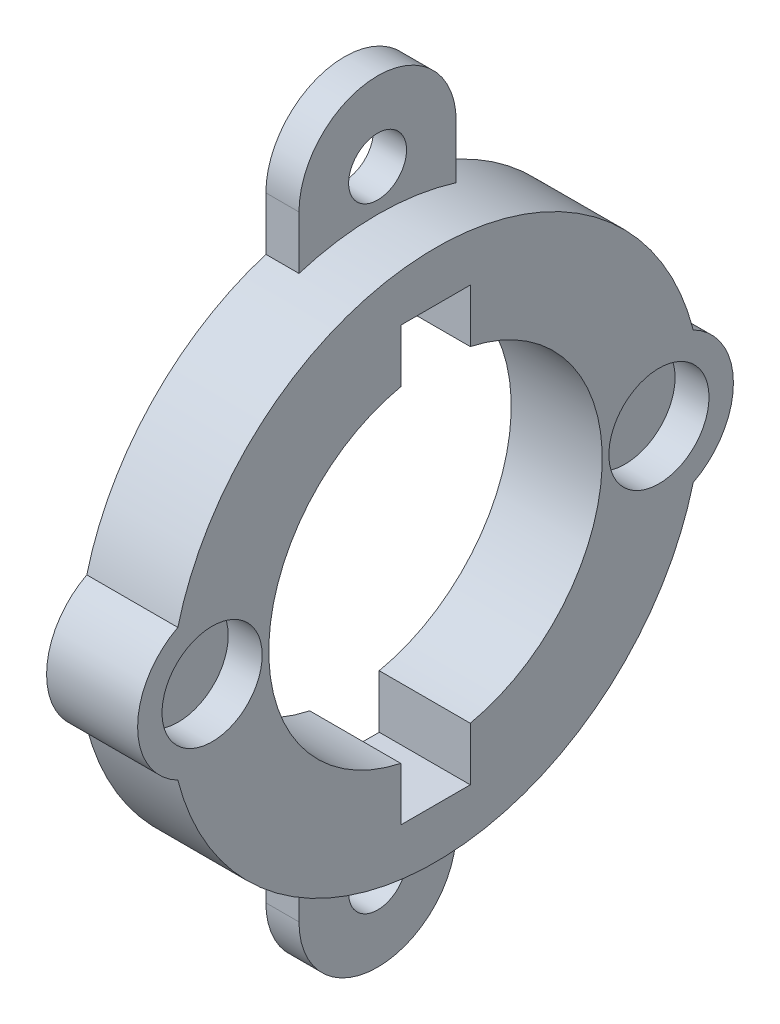
ISO-10303-21;
HEADER;
FILE_DESCRIPTION(('STEP AP214'),'2;1');
FILE_NAME('part.step','',(''),(''),'','','');
FILE_SCHEMA(('AUTOMOTIVE_DESIGN { 1 0 10303 214 1 1 1 1 }'));
ENDSEC;
DATA;
#1=APPLICATION_CONTEXT('core data for automotive mechanical design processes');
#2=APPLICATION_PROTOCOL_DEFINITION('international standard','automotive_design',2000,#1);
#3=PRODUCT_CONTEXT('',#1,'mechanical');
#4=PRODUCT('Part','Part','',(#3));
#5=PRODUCT_RELATED_PRODUCT_CATEGORY('part','',(#4));
#6=PRODUCT_DEFINITION_FORMATION('','',#4);
#7=PRODUCT_DEFINITION_CONTEXT('part definition',#1,'design');
#8=PRODUCT_DEFINITION('design','',#6,#7);
#9=PRODUCT_DEFINITION_SHAPE('','',#8);
#10=(LENGTH_UNIT() NAMED_UNIT(*) SI_UNIT(.MILLI.,.METRE.));
#11=(NAMED_UNIT(*) PLANE_ANGLE_UNIT() SI_UNIT($,.RADIAN.));
#12=(NAMED_UNIT(*) SI_UNIT($,.STERADIAN.) SOLID_ANGLE_UNIT());
#13=UNCERTAINTY_MEASURE_WITH_UNIT(LENGTH_MEASURE(1.E-05),#10,'distance_accuracy_value','');
#14=(GEOMETRIC_REPRESENTATION_CONTEXT(3) GLOBAL_UNCERTAINTY_ASSIGNED_CONTEXT((#13)) GLOBAL_UNIT_ASSIGNED_CONTEXT((#10,
#11,#12)) REPRESENTATION_CONTEXT('',''));
#15=CARTESIAN_POINT('',(0.,0.,0.));
#16=DIRECTION('',(0.,0.,1.));
#17=DIRECTION('',(1.,0.,0.));
#18=AXIS2_PLACEMENT_3D('',#15,#16,#17);
#19=CARTESIAN_POINT('',(5.,15.3571848006072,-4.74999999999994));
#20=DIRECTION('',(0.,0.,1.));
#21=DIRECTION('',(0.,-1.,0.));
#22=AXIS2_PLACEMENT_3D('',#19,#20,#21);
#23=PLANE('',#22);
#24=DIRECTION('',(0.,-1.,0.));
#25=VECTOR('',#24,1.);
#26=CARTESIAN_POINT('',(2.,15.3571848006072,-4.74999999999995));
#27=LINE('',#26,#25);
#28=CARTESIAN_POINT('',(2.,18.575,-4.74999999999992));
#29=VERTEX_POINT('',#28);
#30=CARTESIAN_POINT('',(2.,15.3571848006072,-4.74999999999995));
#31=VERTEX_POINT('',#30);
#32=EDGE_CURVE('E177',#29,#31,#27,.T.);
#33=ORIENTED_EDGE('',*,*,#32,.T.);
#34=DIRECTION('',(-1.,0.,0.));
#35=VECTOR('',#34,1.);
#36=CARTESIAN_POINT('',(5.,15.3571848006072,-4.74999999999994));
#37=LINE('',#36,#35);
#38=CARTESIAN_POINT('',(0.,15.3571848006072,-4.74999999999994));
#39=VERTEX_POINT('',#38);
#40=EDGE_CURVE('E12',#31,#39,#37,.T.);
#41=ORIENTED_EDGE('',*,*,#40,.T.);
#42=DIRECTION('',(0.,1.,0.));
#43=VECTOR('',#42,1.);
#44=CARTESIAN_POINT('',(0.,15.3571848006072,-4.74999999999994));
#45=LINE('',#44,#43);
#46=CARTESIAN_POINT('',(0.,18.575,-4.74999999999993));
#47=VERTEX_POINT('',#46);
#48=EDGE_CURVE('E194',#39,#47,#45,.T.);
#49=ORIENTED_EDGE('',*,*,#48,.T.);
#50=DIRECTION('',(-1.,0.,0.));
#51=VECTOR('',#50,1.);
#52=CARTESIAN_POINT('',(5.,18.575,-4.74999999999993));
#53=LINE('',#52,#51);
#54=EDGE_CURVE('E48',#29,#47,#53,.T.);
#55=ORIENTED_EDGE('',*,*,#54,.F.);
#56=EDGE_LOOP('',(#33,#41,#49,#55));
#57=FACE_BOUND('',#56,.T.);
#58=ADVANCED_FACE('F40',(#57),#23,.F.);
#59=CARTESIAN_POINT('',(5.,18.575,0.));
#60=DIRECTION('',(-1.,0.,0.));
#61=DIRECTION('',(0.,0.,1.));
#62=AXIS2_PLACEMENT_3D('',#59,#60,#61);
#63=CYLINDRICAL_SURFACE('',#62,4.75000000000001);
#64=CARTESIAN_POINT('',(2.,18.575,0.));
#65=DIRECTION('',(1.,0.,0.));
#66=DIRECTION('',(0.,0.,-1.));
#67=AXIS2_PLACEMENT_3D('',#64,#65,#66);
#68=CIRCLE('',#67,4.75);
#69=CARTESIAN_POINT('',(2.,18.575,4.75000000000008));
#70=VERTEX_POINT('',#69);
#71=EDGE_CURVE('E56',#70,#29,#68,.F.);
#72=ORIENTED_EDGE('',*,*,#71,.T.);
#73=ORIENTED_EDGE('',*,*,#54,.T.);
#74=CARTESIAN_POINT('',(0.,18.575,0.));
#75=DIRECTION('',(1.,0.,0.));
#76=DIRECTION('',(0.,0.,-1.));
#77=AXIS2_PLACEMENT_3D('',#74,#75,#76);
#78=CIRCLE('',#77,4.75000000000001);
#79=CARTESIAN_POINT('',(0.,18.575,4.75000000000008));
#80=VERTEX_POINT('',#79);
#81=EDGE_CURVE('E317',#47,#80,#78,.T.);
#82=ORIENTED_EDGE('',*,*,#81,.T.);
#83=DIRECTION('',(-1.,0.,0.));
#84=VECTOR('',#83,1.);
#85=CARTESIAN_POINT('',(5.,18.575,4.75000000000008));
#86=LINE('',#85,#84);
#87=EDGE_CURVE('E190',#70,#80,#86,.T.);
#88=ORIENTED_EDGE('',*,*,#87,.F.);
#89=EDGE_LOOP('',(#72,#73,#82,#88));
#90=FACE_BOUND('',#89,.T.);
#91=ADVANCED_FACE('F187',(#90),#63,.T.);
#92=CARTESIAN_POINT('',(5.,15.3571848006072,4.75000000000007));
#93=DIRECTION('',(0.,0.,-1.));
#94=DIRECTION('',(0.,1.,0.));
#95=AXIS2_PLACEMENT_3D('',#92,#93,#94);
#96=PLANE('',#95);
#97=DIRECTION('',(0.,1.,0.));
#98=VECTOR('',#97,1.);
#99=CARTESIAN_POINT('',(2.,18.575,4.75000000000008));
#100=LINE('',#99,#98);
#101=CARTESIAN_POINT('',(2.,15.3571848006072,4.75000000000007));
#102=VERTEX_POINT('',#101);
#103=EDGE_CURVE('E191',#102,#70,#100,.T.);
#104=ORIENTED_EDGE('',*,*,#103,.T.);
#105=ORIENTED_EDGE('',*,*,#87,.T.);
#106=DIRECTION('',(0.,-1.,0.));
#107=VECTOR('',#106,1.);
#108=CARTESIAN_POINT('',(0.,15.3571848006072,4.75000000000007));
#109=LINE('',#108,#107);
#110=CARTESIAN_POINT('',(0.,15.3571848006072,4.75000000000007));
#111=VERTEX_POINT('',#110);
#112=EDGE_CURVE('E319',#80,#111,#109,.T.);
#113=ORIENTED_EDGE('',*,*,#112,.T.);
#114=DIRECTION('',(-1.,0.,0.));
#115=VECTOR('',#114,1.);
#116=CARTESIAN_POINT('',(5.,15.3571848006072,4.75000000000007));
#117=LINE('',#116,#115);
#118=EDGE_CURVE('E197',#102,#111,#117,.T.);
#119=ORIENTED_EDGE('',*,*,#118,.F.);
#120=EDGE_LOOP('',(#104,#105,#113,#119));
#121=FACE_BOUND('',#120,.T.);
#122=ADVANCED_FACE('F348',(#121),#96,.F.);
#123=CARTESIAN_POINT('',(5.,-15.3571848006072,4.74999999999994));
#124=DIRECTION('',(0.,0.,-1.));
#125=DIRECTION('',(0.,1.,0.));
#126=AXIS2_PLACEMENT_3D('',#123,#124,#125);
#127=PLANE('',#126);
#128=DIRECTION('',(0.,1.,0.));
#129=VECTOR('',#128,1.);
#130=CARTESIAN_POINT('',(2.,-15.3571848006072,4.74999999999995));
#131=LINE('',#130,#129);
#132=CARTESIAN_POINT('',(2.,-18.575,4.74999999999994));
#133=VERTEX_POINT('',#132);
#134=CARTESIAN_POINT('',(2.,-15.3571848006072,4.74999999999995));
#135=VERTEX_POINT('',#134);
#136=EDGE_CURVE('E384',#133,#135,#131,.T.);
#137=ORIENTED_EDGE('',*,*,#136,.T.);
#138=DIRECTION('',(-1.,0.,0.));
#139=VECTOR('',#138,1.);
#140=CARTESIAN_POINT('',(5.,-15.3571848006072,4.74999999999994));
#141=LINE('',#140,#139);
#142=CARTESIAN_POINT('',(0.,-15.3571848006072,4.74999999999994));
#143=VERTEX_POINT('',#142);
#144=EDGE_CURVE('E341',#135,#143,#141,.T.);
#145=ORIENTED_EDGE('',*,*,#144,.T.);
#146=DIRECTION('',(0.,-1.,0.));
#147=VECTOR('',#146,1.);
#148=CARTESIAN_POINT('',(0.,-15.3571848006072,4.74999999999994));
#149=LINE('',#148,#147);
#150=CARTESIAN_POINT('',(0.,-18.575,4.74999999999994));
#151=VERTEX_POINT('',#150);
#152=EDGE_CURVE('E326',#143,#151,#149,.T.);
#153=ORIENTED_EDGE('',*,*,#152,.T.);
#154=DIRECTION('',(-1.,0.,0.));
#155=VECTOR('',#154,1.);
#156=CARTESIAN_POINT('',(5.,-18.575,4.74999999999994));
#157=LINE('',#156,#155);
#158=EDGE_CURVE('E339',#133,#151,#157,.T.);
#159=ORIENTED_EDGE('',*,*,#158,.F.);
#160=EDGE_LOOP('',(#137,#145,#153,#159));
#161=FACE_BOUND('',#160,.T.);
#162=ADVANCED_FACE('F383',(#161),#127,.F.);
#163=CARTESIAN_POINT('',(5.,-18.575,0.));
#164=DIRECTION('',(-1.,0.,0.));
#165=DIRECTION('',(0.,0.,1.));
#166=AXIS2_PLACEMENT_3D('',#163,#164,#165);
#167=CYLINDRICAL_SURFACE('',#166,4.75000000000001);
#168=CARTESIAN_POINT('',(2.,-18.575,0.));
#169=DIRECTION('',(1.,0.,0.));
#170=DIRECTION('',(0.,0.,-1.));
#171=AXIS2_PLACEMENT_3D('',#168,#169,#170);
#172=CIRCLE('',#171,4.75000000000001);
#173=CARTESIAN_POINT('',(2.,-18.575,-4.75000000000008));
#174=VERTEX_POINT('',#173);
#175=EDGE_CURVE('E64',#174,#133,#172,.F.);
#176=ORIENTED_EDGE('',*,*,#175,.T.);
#177=ORIENTED_EDGE('',*,*,#158,.T.);
#178=CARTESIAN_POINT('',(0.,-18.575,0.));
#179=DIRECTION('',(1.,0.,0.));
#180=DIRECTION('',(0.,0.,1.));
#181=AXIS2_PLACEMENT_3D('',#178,#179,#180);
#182=CIRCLE('',#181,4.75000000000001);
#183=CARTESIAN_POINT('',(0.,-18.575,-4.75000000000008));
#184=VERTEX_POINT('',#183);
#185=EDGE_CURVE('E329',#151,#184,#182,.T.);
#186=ORIENTED_EDGE('',*,*,#185,.T.);
#187=DIRECTION('',(-1.,0.,0.));
#188=VECTOR('',#187,1.);
#189=CARTESIAN_POINT('',(5.,-18.575,-4.75000000000008));
#190=LINE('',#189,#188);
#191=EDGE_CURVE('E337',#174,#184,#190,.T.);
#192=ORIENTED_EDGE('',*,*,#191,.F.);
#193=EDGE_LOOP('',(#176,#177,#186,#192));
#194=FACE_BOUND('',#193,.T.);
#195=ADVANCED_FACE('F379',(#194),#167,.T.);
#196=CARTESIAN_POINT('',(5.,-15.3571848006072,-4.75000000000007));
#197=DIRECTION('',(0.,0.,1.));
#198=DIRECTION('',(0.,-1.,0.));
#199=AXIS2_PLACEMENT_3D('',#196,#197,#198);
#200=PLANE('',#199);
#201=DIRECTION('',(0.,-1.,0.));
#202=VECTOR('',#201,1.);
#203=CARTESIAN_POINT('',(2.,-18.575,-4.75000000000008));
#204=LINE('',#203,#202);
#205=CARTESIAN_POINT('',(2.,-15.3571848006072,-4.75000000000006));
#206=VERTEX_POINT('',#205);
#207=EDGE_CURVE('E386',#206,#174,#204,.T.);
#208=ORIENTED_EDGE('',*,*,#207,.T.);
#209=ORIENTED_EDGE('',*,*,#191,.T.);
#210=DIRECTION('',(0.,1.,0.));
#211=VECTOR('',#210,1.);
#212=CARTESIAN_POINT('',(0.,-15.3571848006072,-4.75000000000007));
#213=LINE('',#212,#211);
#214=CARTESIAN_POINT('',(0.,-15.3571848006072,-4.75000000000007));
#215=VERTEX_POINT('',#214);
#216=EDGE_CURVE('E332',#184,#215,#213,.T.);
#217=ORIENTED_EDGE('',*,*,#216,.T.);
#218=DIRECTION('',(-1.,0.,0.));
#219=VECTOR('',#218,1.);
#220=CARTESIAN_POINT('',(5.,-15.3571848006072,-4.75000000000007));
#221=LINE('',#220,#219);
#222=EDGE_CURVE('E335',#206,#215,#221,.T.);
#223=ORIENTED_EDGE('',*,*,#222,.F.);
#224=EDGE_LOOP('',(#208,#209,#217,#223));
#225=FACE_BOUND('',#224,.T.);
#226=ADVANCED_FACE('F375',(#225),#200,.F.);
#227=CARTESIAN_POINT('',(5.,18.575,0.));
#228=DIRECTION('',(-1.,0.,0.));
#229=DIRECTION('',(0.,0.,1.));
#230=AXIS2_PLACEMENT_3D('',#227,#228,#229);
#231=CYLINDRICAL_SURFACE('',#230,1.75);
#232=CARTESIAN_POINT('',(0.,18.575,0.));
#233=DIRECTION('',(1.,0.,0.));
#234=DIRECTION('',(0.,0.,-1.));
#235=AXIS2_PLACEMENT_3D('',#232,#233,#234);
#236=CIRCLE('',#235,1.75);
#237=CARTESIAN_POINT('',(0.,18.575,-1.74999999999992));
#238=VERTEX_POINT('',#237);
#239=EDGE_CURVE('E309',#238,#238,#236,.T.);
#240=ORIENTED_EDGE('',*,*,#239,.F.);
#241=EDGE_LOOP('',(#240));
#242=FACE_BOUND('',#241,.T.);
#243=CARTESIAN_POINT('',(2.,18.575,0.));
#244=DIRECTION('',(1.,0.,0.));
#245=DIRECTION('',(0.,0.,-1.));
#246=AXIS2_PLACEMENT_3D('',#243,#244,#245);
#247=CIRCLE('',#246,1.75);
#248=CARTESIAN_POINT('',(2.,18.575,-1.74999999999992));
#249=VERTEX_POINT('',#248);
#250=EDGE_CURVE('E43',#249,#249,#247,.T.);
#251=ORIENTED_EDGE('',*,*,#250,.T.);
#252=EDGE_LOOP('',(#251));
#253=FACE_BOUND('',#252,.T.);
#254=ADVANCED_FACE('F461',(#242,#253),#231,.F.);
#255=CARTESIAN_POINT('',(5.,-18.575,0.));
#256=DIRECTION('',(-1.,0.,0.));
#257=DIRECTION('',(0.,0.,1.));
#258=AXIS2_PLACEMENT_3D('',#255,#256,#257);
#259=CYLINDRICAL_SURFACE('',#258,1.75);
#260=CARTESIAN_POINT('',(0.,-18.575,0.));
#261=DIRECTION('',(1.,0.,0.));
#262=DIRECTION('',(0.,0.,1.));
#263=AXIS2_PLACEMENT_3D('',#260,#261,#262);
#264=CIRCLE('',#263,1.75);
#265=CARTESIAN_POINT('',(0.,-18.575,1.74999999999993));
#266=VERTEX_POINT('',#265);
#267=EDGE_CURVE('E286',#266,#266,#264,.T.);
#268=ORIENTED_EDGE('',*,*,#267,.F.);
#269=EDGE_LOOP('',(#268));
#270=FACE_BOUND('',#269,.T.);
#271=CARTESIAN_POINT('',(2.,-18.575,0.));
#272=DIRECTION('',(1.,0.,0.));
#273=DIRECTION('',(0.,0.,-1.));
#274=AXIS2_PLACEMENT_3D('',#271,#272,#273);
#275=CIRCLE('',#274,1.75);
#276=CARTESIAN_POINT('',(2.,-18.575,-1.75000000000007));
#277=VERTEX_POINT('',#276);
#278=EDGE_CURVE('E183',#277,#277,#275,.T.);
#279=ORIENTED_EDGE('',*,*,#278,.T.);
#280=EDGE_LOOP('',(#279));
#281=FACE_BOUND('',#280,.T.);
#282=ADVANCED_FACE('F465',(#270,#281),#259,.F.);
#283=CARTESIAN_POINT('',(5.,0.,0.));
#284=DIRECTION('',(-1.,0.,0.));
#285=DIRECTION('',(0.,0.,1.));
#286=AXIS2_PLACEMENT_3D('',#283,#284,#285);
#287=CYLINDRICAL_SURFACE('',#286,16.075);
#288=ORIENTED_EDGE('',*,*,#40,.F.);
#289=CARTESIAN_POINT('',(2.,0.,0.));
#290=DIRECTION('',(1.,0.,0.));
#291=DIRECTION('',(0.,0.,-1.));
#292=AXIS2_PLACEMENT_3D('',#289,#290,#291);
#293=CIRCLE('',#292,16.075);
#294=EDGE_CURVE('E179',#31,#102,#293,.T.);
#295=ORIENTED_EDGE('',*,*,#294,.T.);
#296=ORIENTED_EDGE('',*,*,#118,.T.);
#297=CARTESIAN_POINT('',(0.,0.,0.));
#298=DIRECTION('',(1.,0.,0.));
#299=DIRECTION('',(0.,0.,-1.));
#300=AXIS2_PLACEMENT_3D('',#297,#298,#299);
#301=CIRCLE('',#300,16.075);
#302=CARTESIAN_POINT('',(0.,3.99533525899501,15.5705787037037));
#303=VERTEX_POINT('',#302);
#304=EDGE_CURVE('E323',#111,#303,#301,.T.);
#305=ORIENTED_EDGE('',*,*,#304,.T.);
#306=DIRECTION('',(-1.,0.,0.));
#307=VECTOR('',#306,1.);
#308=CARTESIAN_POINT('',(2.75,3.99533525899501,15.5705787037037));
#309=LINE('',#308,#307);
#310=CARTESIAN_POINT('',(5.5,3.99533525899501,15.5705787037037));
#311=VERTEX_POINT('',#310);
#312=EDGE_CURVE('E226',#303,#311,#309,.F.);
#313=ORIENTED_EDGE('',*,*,#312,.T.);
#314=CARTESIAN_POINT('',(5.5,0.,0.));
#315=DIRECTION('',(1.,0.,0.));
#316=DIRECTION('',(0.,0.,-1.));
#317=AXIS2_PLACEMENT_3D('',#314,#315,#316);
#318=CIRCLE('',#317,16.075);
#319=CARTESIAN_POINT('',(5.5,3.99533525899501,-15.5705787037037));
#320=VERTEX_POINT('',#319);
#321=EDGE_CURVE('E264',#320,#311,#318,.T.);
#322=ORIENTED_EDGE('',*,*,#321,.F.);
#323=DIRECTION('',(-1.,0.,0.));
#324=VECTOR('',#323,1.);
#325=CARTESIAN_POINT('',(2.75,3.99533525899501,-15.5705787037037));
#326=LINE('',#325,#324);
#327=CARTESIAN_POINT('',(0.,3.99533525899501,-15.5705787037037));
#328=VERTEX_POINT('',#327);
#329=EDGE_CURVE('E235',#320,#328,#326,.T.);
#330=ORIENTED_EDGE('',*,*,#329,.T.);
#331=CARTESIAN_POINT('',(0.,0.,0.));
#332=DIRECTION('',(1.,0.,0.));
#333=DIRECTION('',(0.,0.,-1.));
#334=AXIS2_PLACEMENT_3D('',#331,#332,#333);
#335=CIRCLE('',#334,16.075);
#336=EDGE_CURVE('E312',#328,#39,#335,.T.);
#337=ORIENTED_EDGE('',*,*,#336,.T.);
#338=EDGE_LOOP('',(#288,#295,#296,#305,#313,#322,#330,#337));
#339=FACE_BOUND('',#338,.T.);
#340=ADVANCED_FACE('F344',(#339),#287,.T.);
#341=CARTESIAN_POINT('',(5.,0.,0.));
#342=DIRECTION('',(-1.,0.,0.));
#343=DIRECTION('',(0.,0.,1.));
#344=AXIS2_PLACEMENT_3D('',#341,#342,#343);
#345=CYLINDRICAL_SURFACE('',#344,10.075);
#346=CARTESIAN_POINT('',(5.5,0.,0.));
#347=DIRECTION('',(1.,0.,0.));
#348=DIRECTION('',(0.,0.,-1.));
#349=AXIS2_PLACEMENT_3D('',#346,#347,#348);
#350=CIRCLE('',#349,10.075);
#351=CARTESIAN_POINT('',(5.5,9.85371122978545,2.1));
#352=VERTEX_POINT('',#351);
#353=CARTESIAN_POINT('',(5.5,-9.85371122978545,2.1));
#354=VERTEX_POINT('',#353);
#355=EDGE_CURVE('E241',#352,#354,#350,.T.);
#356=ORIENTED_EDGE('',*,*,#355,.T.);
#357=DIRECTION('',(-1.,0.,0.));
#358=VECTOR('',#357,1.);
#359=CARTESIAN_POINT('',(5.,-9.85371122978545,2.1));
#360=LINE('',#359,#358);
#361=CARTESIAN_POINT('',(0.,-9.85371122978545,2.1));
#362=VERTEX_POINT('',#361);
#363=EDGE_CURVE('E296',#354,#362,#360,.T.);
#364=ORIENTED_EDGE('',*,*,#363,.T.);
#365=CARTESIAN_POINT('',(0.,0.,0.));
#366=DIRECTION('',(1.,0.,0.));
#367=DIRECTION('',(0.,0.,-1.));
#368=AXIS2_PLACEMENT_3D('',#365,#366,#367);
#369=CIRCLE('',#368,10.075);
#370=CARTESIAN_POINT('',(0.,9.85371122978545,2.1));
#371=VERTEX_POINT('',#370);
#372=EDGE_CURVE('E308',#371,#362,#369,.T.);
#373=ORIENTED_EDGE('',*,*,#372,.F.);
#374=DIRECTION('',(-1.,0.,0.));
#375=VECTOR('',#374,1.);
#376=CARTESIAN_POINT('',(5.,9.85371122978545,2.1));
#377=LINE('',#376,#375);
#378=EDGE_CURVE('E268',#371,#352,#377,.F.);
#379=ORIENTED_EDGE('',*,*,#378,.T.);
#380=EDGE_LOOP('',(#356,#364,#373,#379));
#381=FACE_BOUND('',#380,.T.);
#382=ADVANCED_FACE('F415',(#381),#345,.F.);
#383=CARTESIAN_POINT('',(0.,0.,0.));
#384=DIRECTION('',(1.,0.,0.));
#385=DIRECTION('',(0.,0.,-1.));
#386=AXIS2_PLACEMENT_3D('',#383,#384,#385);
#387=PLANE('',#386);
#388=ORIENTED_EDGE('',*,*,#372,.T.);
#389=DIRECTION('',(0.,1.,0.));
#390=VECTOR('',#389,1.);
#391=CARTESIAN_POINT('',(0.,13.075,2.1));
#392=LINE('',#391,#390);
#393=CARTESIAN_POINT('',(0.,-13.075,2.1));
#394=VERTEX_POINT('',#393);
#395=EDGE_CURVE('E291',#394,#362,#392,.T.);
#396=ORIENTED_EDGE('',*,*,#395,.F.);
#397=DIRECTION('',(0.,0.,1.));
#398=VECTOR('',#397,1.);
#399=CARTESIAN_POINT('',(0.,-13.075,-2.1));
#400=LINE('',#399,#398);
#401=CARTESIAN_POINT('',(0.,-13.075,-2.1));
#402=VERTEX_POINT('',#401);
#403=EDGE_CURVE('E292',#402,#394,#400,.T.);
#404=ORIENTED_EDGE('',*,*,#403,.F.);
#405=DIRECTION('',(0.,-1.,0.));
#406=VECTOR('',#405,1.);
#407=CARTESIAN_POINT('',(0.,13.075,-2.1));
#408=LINE('',#407,#406);
#409=CARTESIAN_POINT('',(0.,-9.85371122978545,-2.1));
#410=VERTEX_POINT('',#409);
#411=EDGE_CURVE('E288',#410,#402,#408,.T.);
#412=ORIENTED_EDGE('',*,*,#411,.F.);
#413=CARTESIAN_POINT('',(0.,9.85371122978545,-2.1));
#414=VERTEX_POINT('',#413);
#415=EDGE_CURVE('E306',#410,#414,#369,.T.);
#416=ORIENTED_EDGE('',*,*,#415,.T.);
#417=DIRECTION('',(0.,-1.,0.));
#418=VECTOR('',#417,1.);
#419=CARTESIAN_POINT('',(0.,13.075,-2.1));
#420=LINE('',#419,#418);
#421=CARTESIAN_POINT('',(0.,13.075,-2.1));
#422=VERTEX_POINT('',#421);
#423=EDGE_CURVE('E274',#422,#414,#420,.T.);
#424=ORIENTED_EDGE('',*,*,#423,.F.);
#425=DIRECTION('',(0.,0.,-1.));
#426=VECTOR('',#425,1.);
#427=CARTESIAN_POINT('',(0.,13.075,-2.1));
#428=LINE('',#427,#426);
#429=CARTESIAN_POINT('',(0.,13.075,2.1));
#430=VERTEX_POINT('',#429);
#431=EDGE_CURVE('E280',#430,#422,#428,.T.);
#432=ORIENTED_EDGE('',*,*,#431,.F.);
#433=DIRECTION('',(0.,1.,0.));
#434=VECTOR('',#433,1.);
#435=CARTESIAN_POINT('',(0.,13.075,2.1));
#436=LINE('',#435,#434);
#437=EDGE_CURVE('E277',#371,#430,#436,.T.);
#438=ORIENTED_EDGE('',*,*,#437,.F.);
#439=EDGE_LOOP('',(#388,#396,#404,#412,#416,#424,#432,#438));
#440=FACE_BOUND('',#439,.T.);
#441=CARTESIAN_POINT('',(0.,0.,13.5));
#442=DIRECTION('',(-1.,0.,0.));
#443=DIRECTION('',(0.,0.,-1.));
#444=AXIS2_PLACEMENT_3D('',#441,#442,#443);
#445=CIRCLE('',#444,4.5);
#446=CARTESIAN_POINT('',(0.,-3.99533525899501,15.5705787037037));
#447=VERTEX_POINT('',#446);
#448=EDGE_CURVE('E219',#447,#303,#445,.T.);
#449=ORIENTED_EDGE('',*,*,#448,.T.);
#450=ORIENTED_EDGE('',*,*,#304,.F.);
#451=ORIENTED_EDGE('',*,*,#112,.F.);
#452=ORIENTED_EDGE('',*,*,#81,.F.);
#453=ORIENTED_EDGE('',*,*,#48,.F.);
#454=ORIENTED_EDGE('',*,*,#336,.F.);
#455=CARTESIAN_POINT('',(0.,0.,-13.5));
#456=DIRECTION('',(-1.,0.,0.));
#457=DIRECTION('',(0.,0.,1.));
#458=AXIS2_PLACEMENT_3D('',#455,#456,#457);
#459=CIRCLE('',#458,4.5);
#460=CARTESIAN_POINT('',(0.,-3.99533525899501,-15.5705787037037));
#461=VERTEX_POINT('',#460);
#462=EDGE_CURVE('E229',#328,#461,#459,.T.);
#463=ORIENTED_EDGE('',*,*,#462,.T.);
#464=EDGE_CURVE('E313',#215,#461,#335,.T.);
#465=ORIENTED_EDGE('',*,*,#464,.F.);
#466=ORIENTED_EDGE('',*,*,#216,.F.);
#467=ORIENTED_EDGE('',*,*,#185,.F.);
#468=ORIENTED_EDGE('',*,*,#152,.F.);
#469=EDGE_CURVE('E322',#447,#143,#301,.T.);
#470=ORIENTED_EDGE('',*,*,#469,.F.);
#471=EDGE_LOOP('',(#449,#450,#451,#452,#453,#454,#463,#465,#466,#467,#468,#470));
#472=FACE_BOUND('',#471,.T.);
#473=ORIENTED_EDGE('',*,*,#239,.T.);
#474=EDGE_LOOP('',(#473));
#475=FACE_BOUND('',#474,.T.);
#476=ORIENTED_EDGE('',*,*,#267,.T.);
#477=EDGE_LOOP('',(#476));
#478=FACE_BOUND('',#477,.T.);
#479=ADVANCED_FACE('F350',(#440,#472,#475,#478),#387,.F.);
#480=ORIENTED_EDGE('',*,*,#144,.F.);
#481=CARTESIAN_POINT('',(2.,0.,0.));
#482=DIRECTION('',(1.,0.,0.));
#483=DIRECTION('',(0.,0.,-1.));
#484=AXIS2_PLACEMENT_3D('',#481,#482,#483);
#485=CIRCLE('',#484,16.075);
#486=EDGE_CURVE('E373',#135,#206,#485,.T.);
#487=ORIENTED_EDGE('',*,*,#486,.T.);
#488=ORIENTED_EDGE('',*,*,#222,.T.);
#489=ORIENTED_EDGE('',*,*,#464,.T.);
#490=DIRECTION('',(-1.,0.,0.));
#491=VECTOR('',#490,1.);
#492=CARTESIAN_POINT('',(2.75,-3.99533525899501,-15.5705787037037));
#493=LINE('',#492,#491);
#494=CARTESIAN_POINT('',(5.5,-3.99533525899501,-15.5705787037037));
#495=VERTEX_POINT('',#494);
#496=EDGE_CURVE('E238',#461,#495,#493,.F.);
#497=ORIENTED_EDGE('',*,*,#496,.T.);
#498=CARTESIAN_POINT('',(5.5,-3.99533525899501,15.5705787037037));
#499=VERTEX_POINT('',#498);
#500=EDGE_CURVE('E263',#499,#495,#318,.T.);
#501=ORIENTED_EDGE('',*,*,#500,.F.);
#502=DIRECTION('',(-1.,0.,0.));
#503=VECTOR('',#502,1.);
#504=CARTESIAN_POINT('',(2.75,-3.99533525899501,15.5705787037037));
#505=LINE('',#504,#503);
#506=EDGE_CURVE('E223',#499,#447,#505,.T.);
#507=ORIENTED_EDGE('',*,*,#506,.T.);
#508=ORIENTED_EDGE('',*,*,#469,.T.);
#509=EDGE_LOOP('',(#480,#487,#488,#489,#497,#501,#507,#508));
#510=FACE_BOUND('',#509,.T.);
#511=ADVANCED_FACE('F361',(#510),#287,.T.);
#512=CARTESIAN_POINT('',(5.5,0.,0.));
#513=DIRECTION('',(1.,0.,0.));
#514=DIRECTION('',(0.,0.,-1.));
#515=AXIS2_PLACEMENT_3D('',#512,#513,#514);
#516=CIRCLE('',#515,10.075);
#517=CARTESIAN_POINT('',(5.5,-9.85371122978545,-2.1));
#518=VERTEX_POINT('',#517);
#519=CARTESIAN_POINT('',(5.5,9.85371122978545,-2.1));
#520=VERTEX_POINT('',#519);
#521=EDGE_CURVE('E252',#518,#520,#516,.T.);
#522=ORIENTED_EDGE('',*,*,#521,.T.);
#523=DIRECTION('',(-1.,0.,0.));
#524=VECTOR('',#523,1.);
#525=CARTESIAN_POINT('',(5.,9.85371122978545,-2.1));
#526=LINE('',#525,#524);
#527=EDGE_CURVE('E270',#520,#414,#526,.T.);
#528=ORIENTED_EDGE('',*,*,#527,.T.);
#529=ORIENTED_EDGE('',*,*,#415,.F.);
#530=DIRECTION('',(-1.,0.,0.));
#531=VECTOR('',#530,1.);
#532=CARTESIAN_POINT('',(5.,-9.85371122978545,-2.1));
#533=LINE('',#532,#531);
#534=EDGE_CURVE('E271',#410,#518,#533,.F.);
#535=ORIENTED_EDGE('',*,*,#534,.T.);
#536=EDGE_LOOP('',(#522,#528,#529,#535));
#537=FACE_BOUND('',#536,.T.);
#538=ADVANCED_FACE('F430',(#537),#345,.F.);
#539=CARTESIAN_POINT('',(5.001,13.075,-2.1));
#540=DIRECTION('',(0.,0.,-1.));
#541=DIRECTION('',(-1.,0.,0.));
#542=AXIS2_PLACEMENT_3D('',#539,#540,#541);
#543=PLANE('',#542);
#544=ORIENTED_EDGE('',*,*,#534,.F.);
#545=ORIENTED_EDGE('',*,*,#411,.T.);
#546=DIRECTION('',(-1.,0.,0.));
#547=VECTOR('',#546,1.);
#548=CARTESIAN_POINT('',(5.001,-13.075,-2.1));
#549=LINE('',#548,#547);
#550=CARTESIAN_POINT('',(5.5,-13.075,-2.1));
#551=VERTEX_POINT('',#550);
#552=EDGE_CURVE('E295',#551,#402,#549,.T.);
#553=ORIENTED_EDGE('',*,*,#552,.F.);
#554=DIRECTION('',(0.,1.,0.));
#555=VECTOR('',#554,1.);
#556=CARTESIAN_POINT('',(5.5,-13.075,-2.1));
#557=LINE('',#556,#555);
#558=EDGE_CURVE('E249',#551,#518,#557,.T.);
#559=ORIENTED_EDGE('',*,*,#558,.T.);
#560=EDGE_LOOP('',(#544,#545,#553,#559));
#561=FACE_BOUND('',#560,.T.);
#562=ADVANCED_FACE('F432',(#561),#543,.F.);
#563=CARTESIAN_POINT('',(5.001,13.075,2.1));
#564=DIRECTION('',(0.,0.,1.));
#565=DIRECTION('',(1.,0.,0.));
#566=AXIS2_PLACEMENT_3D('',#563,#564,#565);
#567=PLANE('',#566);
#568=DIRECTION('',(-1.,0.,0.));
#569=VECTOR('',#568,1.);
#570=CARTESIAN_POINT('',(5.001,-13.075,2.1));
#571=LINE('',#570,#569);
#572=CARTESIAN_POINT('',(5.5,-13.075,2.1));
#573=VERTEX_POINT('',#572);
#574=EDGE_CURVE('E267',#573,#394,#571,.T.);
#575=ORIENTED_EDGE('',*,*,#574,.T.);
#576=ORIENTED_EDGE('',*,*,#395,.T.);
#577=ORIENTED_EDGE('',*,*,#363,.F.);
#578=DIRECTION('',(0.,-1.,0.));
#579=VECTOR('',#578,1.);
#580=CARTESIAN_POINT('',(5.5,-9.85371122978545,2.1));
#581=LINE('',#580,#579);
#582=EDGE_CURVE('E243',#354,#573,#581,.T.);
#583=ORIENTED_EDGE('',*,*,#582,.T.);
#584=EDGE_LOOP('',(#575,#576,#577,#583));
#585=FACE_BOUND('',#584,.T.);
#586=ADVANCED_FACE('F411',(#585),#567,.F.);
#587=CARTESIAN_POINT('',(5.001,-13.075,-2.1));
#588=DIRECTION('',(0.,-1.,0.));
#589=DIRECTION('',(0.,0.,-1.));
#590=AXIS2_PLACEMENT_3D('',#587,#588,#589);
#591=PLANE('',#590);
#592=ORIENTED_EDGE('',*,*,#552,.T.);
#593=ORIENTED_EDGE('',*,*,#403,.T.);
#594=ORIENTED_EDGE('',*,*,#574,.F.);
#595=DIRECTION('',(0.,0.,-1.));
#596=VECTOR('',#595,1.);
#597=CARTESIAN_POINT('',(5.5,-13.075,2.1));
#598=LINE('',#597,#596);
#599=EDGE_CURVE('E246',#573,#551,#598,.T.);
#600=ORIENTED_EDGE('',*,*,#599,.T.);
#601=EDGE_LOOP('',(#592,#593,#594,#600));
#602=FACE_BOUND('',#601,.T.);
#603=ADVANCED_FACE('F436',(#602),#591,.F.);
#604=CARTESIAN_POINT('',(5.001,13.075,2.1));
#605=DIRECTION('',(0.,0.,1.));
#606=DIRECTION('',(1.,0.,0.));
#607=AXIS2_PLACEMENT_3D('',#604,#605,#606);
#608=PLANE('',#607);
#609=ORIENTED_EDGE('',*,*,#378,.F.);
#610=ORIENTED_EDGE('',*,*,#437,.T.);
#611=DIRECTION('',(-1.,0.,0.));
#612=VECTOR('',#611,1.);
#613=CARTESIAN_POINT('',(5.001,13.075,2.1));
#614=LINE('',#613,#612);
#615=CARTESIAN_POINT('',(5.5,13.075,2.1));
#616=VERTEX_POINT('',#615);
#617=EDGE_CURVE('E283',#616,#430,#614,.T.);
#618=ORIENTED_EDGE('',*,*,#617,.F.);
#619=DIRECTION('',(0.,-1.,0.));
#620=VECTOR('',#619,1.);
#621=CARTESIAN_POINT('',(5.5,13.075,2.1));
#622=LINE('',#621,#620);
#623=EDGE_CURVE('E260',#616,#352,#622,.T.);
#624=ORIENTED_EDGE('',*,*,#623,.T.);
#625=EDGE_LOOP('',(#609,#610,#618,#624));
#626=FACE_BOUND('',#625,.T.);
#627=ADVANCED_FACE('F418',(#626),#608,.F.);
#628=CARTESIAN_POINT('',(5.001,13.075,-2.1));
#629=DIRECTION('',(0.,1.,0.));
#630=DIRECTION('',(0.,0.,1.));
#631=AXIS2_PLACEMENT_3D('',#628,#629,#630);
#632=PLANE('',#631);
#633=ORIENTED_EDGE('',*,*,#617,.T.);
#634=ORIENTED_EDGE('',*,*,#431,.T.);
#635=DIRECTION('',(-1.,0.,0.));
#636=VECTOR('',#635,1.);
#637=CARTESIAN_POINT('',(5.001,13.075,-2.1));
#638=LINE('',#637,#636);
#639=CARTESIAN_POINT('',(5.5,13.075,-2.1));
#640=VERTEX_POINT('',#639);
#641=EDGE_CURVE('E284',#640,#422,#638,.T.);
#642=ORIENTED_EDGE('',*,*,#641,.F.);
#643=DIRECTION('',(0.,0.,1.));
#644=VECTOR('',#643,1.);
#645=CARTESIAN_POINT('',(5.5,13.075,-2.1));
#646=LINE('',#645,#644);
#647=EDGE_CURVE('E257',#640,#616,#646,.T.);
#648=ORIENTED_EDGE('',*,*,#647,.T.);
#649=EDGE_LOOP('',(#633,#634,#642,#648));
#650=FACE_BOUND('',#649,.T.);
#651=ADVANCED_FACE('F423',(#650),#632,.F.);
#652=CARTESIAN_POINT('',(5.001,13.075,-2.1));
#653=DIRECTION('',(0.,0.,-1.));
#654=DIRECTION('',(-1.,0.,0.));
#655=AXIS2_PLACEMENT_3D('',#652,#653,#654);
#656=PLANE('',#655);
#657=ORIENTED_EDGE('',*,*,#641,.T.);
#658=ORIENTED_EDGE('',*,*,#423,.T.);
#659=ORIENTED_EDGE('',*,*,#527,.F.);
#660=DIRECTION('',(0.,1.,0.));
#661=VECTOR('',#660,1.);
#662=CARTESIAN_POINT('',(5.5,9.85371122978545,-2.1));
#663=LINE('',#662,#661);
#664=EDGE_CURVE('E254',#520,#640,#663,.T.);
#665=ORIENTED_EDGE('',*,*,#664,.T.);
#666=EDGE_LOOP('',(#657,#658,#659,#665));
#667=FACE_BOUND('',#666,.T.);
#668=ADVANCED_FACE('F400',(#667),#656,.F.);
#669=CARTESIAN_POINT('',(5.5,0.,0.));
#670=DIRECTION('',(1.,0.,0.));
#671=DIRECTION('',(0.,0.,-1.));
#672=AXIS2_PLACEMENT_3D('',#669,#670,#671);
#673=PLANE('',#672);
#674=CARTESIAN_POINT('',(5.5,0.,13.5));
#675=DIRECTION('',(1.,0.,0.));
#676=DIRECTION('',(0.,0.,-1.));
#677=AXIS2_PLACEMENT_3D('',#674,#675,#676);
#678=CIRCLE('',#677,3.025);
#679=CARTESIAN_POINT('',(5.5,0.,10.475));
#680=VERTEX_POINT('',#679);
#681=EDGE_CURVE('E213',#680,#680,#678,.T.);
#682=ORIENTED_EDGE('',*,*,#681,.F.);
#683=EDGE_LOOP('',(#682));
#684=FACE_BOUND('',#683,.T.);
#685=CARTESIAN_POINT('',(5.5,0.,-13.5));
#686=DIRECTION('',(1.,0.,0.));
#687=DIRECTION('',(0.,0.,-1.));
#688=AXIS2_PLACEMENT_3D('',#685,#686,#687);
#689=CIRCLE('',#688,3.025);
#690=CARTESIAN_POINT('',(5.5,0.,-16.525));
#691=VERTEX_POINT('',#690);
#692=EDGE_CURVE('E208',#691,#691,#689,.T.);
#693=ORIENTED_EDGE('',*,*,#692,.F.);
#694=EDGE_LOOP('',(#693));
#695=FACE_BOUND('',#694,.T.);
#696=ORIENTED_EDGE('',*,*,#582,.F.);
#697=ORIENTED_EDGE('',*,*,#355,.F.);
#698=ORIENTED_EDGE('',*,*,#623,.F.);
#699=ORIENTED_EDGE('',*,*,#647,.F.);
#700=ORIENTED_EDGE('',*,*,#664,.F.);
#701=ORIENTED_EDGE('',*,*,#521,.F.);
#702=ORIENTED_EDGE('',*,*,#558,.F.);
#703=ORIENTED_EDGE('',*,*,#599,.F.);
#704=EDGE_LOOP('',(#696,#697,#698,#699,#700,#701,#702,#703));
#705=FACE_BOUND('',#704,.T.);
#706=ORIENTED_EDGE('',*,*,#321,.T.);
#707=CARTESIAN_POINT('',(5.5,0.,13.5));
#708=DIRECTION('',(1.,0.,0.));
#709=DIRECTION('',(0.,0.,-1.));
#710=AXIS2_PLACEMENT_3D('',#707,#708,#709);
#711=CIRCLE('',#710,4.5);
#712=EDGE_CURVE('E217',#499,#311,#711,.F.);
#713=ORIENTED_EDGE('',*,*,#712,.F.);
#714=ORIENTED_EDGE('',*,*,#500,.T.);
#715=CARTESIAN_POINT('',(5.5,0.,-13.5));
#716=DIRECTION('',(1.,0.,0.));
#717=DIRECTION('',(0.,0.,-1.));
#718=AXIS2_PLACEMENT_3D('',#715,#716,#717);
#719=CIRCLE('',#718,4.5);
#720=EDGE_CURVE('E232',#320,#495,#719,.F.);
#721=ORIENTED_EDGE('',*,*,#720,.F.);
#722=EDGE_LOOP('',(#706,#713,#714,#721));
#723=FACE_BOUND('',#722,.T.);
#724=ADVANCED_FACE('F364',(#684,#695,#705,#723),#673,.T.);
#725=CARTESIAN_POINT('',(18.2178920314521,0.,-13.5));
#726=DIRECTION('',(-1.,0.,0.));
#727=DIRECTION('',(0.,0.,1.));
#728=AXIS2_PLACEMENT_3D('',#725,#726,#727);
#729=CYLINDRICAL_SURFACE('',#728,4.5);
#730=ORIENTED_EDGE('',*,*,#496,.F.);
#731=ORIENTED_EDGE('',*,*,#462,.F.);
#732=ORIENTED_EDGE('',*,*,#329,.F.);
#733=ORIENTED_EDGE('',*,*,#720,.T.);
#734=EDGE_LOOP('',(#730,#731,#732,#733));
#735=FACE_BOUND('',#734,.T.);
#736=ADVANCED_FACE('F367',(#735),#729,.T.);
#737=CARTESIAN_POINT('',(18.2178920314521,0.,13.5));
#738=DIRECTION('',(-1.,0.,0.));
#739=DIRECTION('',(0.,0.,1.));
#740=AXIS2_PLACEMENT_3D('',#737,#738,#739);
#741=CYLINDRICAL_SURFACE('',#740,4.5);
#742=ORIENTED_EDGE('',*,*,#312,.F.);
#743=ORIENTED_EDGE('',*,*,#448,.F.);
#744=ORIENTED_EDGE('',*,*,#506,.F.);
#745=ORIENTED_EDGE('',*,*,#712,.T.);
#746=EDGE_LOOP('',(#742,#743,#744,#745));
#747=FACE_BOUND('',#746,.T.);
#748=ADVANCED_FACE('F356',(#747),#741,.T.);
#749=CARTESIAN_POINT('',(3.45,0.,-13.5));
#750=DIRECTION('',(1.,0.,0.));
#751=DIRECTION('',(0.,0.,-1.));
#752=AXIS2_PLACEMENT_3D('',#749,#750,#751);
#753=CYLINDRICAL_SURFACE('',#752,3.025);
#754=CARTESIAN_POINT('',(3.45,0.,-13.5));
#755=DIRECTION('',(1.,0.,0.));
#756=DIRECTION('',(0.,0.,-1.));
#757=AXIS2_PLACEMENT_3D('',#754,#755,#756);
#758=CIRCLE('',#757,3.025);
#759=CARTESIAN_POINT('',(3.45,0.,-16.525));
#760=VERTEX_POINT('',#759);
#761=EDGE_CURVE('E204',#760,#760,#758,.T.);
#762=ORIENTED_EDGE('',*,*,#761,.F.);
#763=EDGE_LOOP('',(#762));
#764=FACE_BOUND('',#763,.T.);
#765=ORIENTED_EDGE('',*,*,#692,.T.);
#766=EDGE_LOOP('',(#765));
#767=FACE_BOUND('',#766,.T.);
#768=ADVANCED_FACE('F491',(#764,#767),#753,.F.);
#769=CARTESIAN_POINT('',(3.45,0.,-13.5));
#770=DIRECTION('',(1.,0.,0.));
#771=DIRECTION('',(0.,0.,-1.));
#772=AXIS2_PLACEMENT_3D('',#769,#770,#771);
#773=PLANE('',#772);
#774=ORIENTED_EDGE('',*,*,#761,.T.);
#775=EDGE_LOOP('',(#774));
#776=FACE_BOUND('',#775,.T.);
#777=ADVANCED_FACE('F492',(#776),#773,.T.);
#778=CARTESIAN_POINT('',(3.45,0.,13.5));
#779=DIRECTION('',(1.,0.,0.));
#780=DIRECTION('',(0.,0.,-1.));
#781=AXIS2_PLACEMENT_3D('',#778,#779,#780);
#782=CYLINDRICAL_SURFACE('',#781,3.025);
#783=CARTESIAN_POINT('',(3.45,0.,13.5));
#784=DIRECTION('',(1.,0.,0.));
#785=DIRECTION('',(0.,0.,-1.));
#786=AXIS2_PLACEMENT_3D('',#783,#784,#785);
#787=CIRCLE('',#786,3.025);
#788=CARTESIAN_POINT('',(3.45,0.,10.475));
#789=VERTEX_POINT('',#788);
#790=EDGE_CURVE('E220',#789,#789,#787,.T.);
#791=ORIENTED_EDGE('',*,*,#790,.F.);
#792=EDGE_LOOP('',(#791));
#793=FACE_BOUND('',#792,.T.);
#794=ORIENTED_EDGE('',*,*,#681,.T.);
#795=EDGE_LOOP('',(#794));
#796=FACE_BOUND('',#795,.T.);
#797=ADVANCED_FACE('F396',(#793,#796),#782,.F.);
#798=CARTESIAN_POINT('',(3.45,0.,13.5));
#799=DIRECTION('',(1.,0.,0.));
#800=DIRECTION('',(0.,0.,-1.));
#801=AXIS2_PLACEMENT_3D('',#798,#799,#800);
#802=PLANE('',#801);
#803=ORIENTED_EDGE('',*,*,#790,.T.);
#804=EDGE_LOOP('',(#803));
#805=FACE_BOUND('',#804,.T.);
#806=ADVANCED_FACE('F500',(#805),#802,.T.);
#807=CARTESIAN_POINT('',(2.,0.,0.));
#808=DIRECTION('',(1.,0.,0.));
#809=DIRECTION('',(0.,0.,-1.));
#810=AXIS2_PLACEMENT_3D('',#807,#808,#809);
#811=PLANE('',#810);
#812=ORIENTED_EDGE('',*,*,#278,.F.);
#813=EDGE_LOOP('',(#812));
#814=FACE_BOUND('',#813,.T.);
#815=ORIENTED_EDGE('',*,*,#486,.F.);
#816=ORIENTED_EDGE('',*,*,#136,.F.);
#817=ORIENTED_EDGE('',*,*,#175,.F.);
#818=ORIENTED_EDGE('',*,*,#207,.F.);
#819=EDGE_LOOP('',(#815,#816,#817,#818));
#820=FACE_BOUND('',#819,.T.);
#821=ADVANCED_FACE('F504',(#814,#820),#811,.T.);
#822=CARTESIAN_POINT('',(2.,0.,0.));
#823=DIRECTION('',(1.,0.,0.));
#824=DIRECTION('',(0.,0.,-1.));
#825=AXIS2_PLACEMENT_3D('',#822,#823,#824);
#826=PLANE('',#825);
#827=ORIENTED_EDGE('',*,*,#250,.F.);
#828=EDGE_LOOP('',(#827));
#829=FACE_BOUND('',#828,.T.);
#830=ORIENTED_EDGE('',*,*,#294,.F.);
#831=ORIENTED_EDGE('',*,*,#32,.F.);
#832=ORIENTED_EDGE('',*,*,#71,.F.);
#833=ORIENTED_EDGE('',*,*,#103,.F.);
#834=EDGE_LOOP('',(#830,#831,#832,#833));
#835=FACE_BOUND('',#834,.T.);
#836=ADVANCED_FACE('F178',(#829,#835),#826,.T.);
#837=CLOSED_SHELL('',(#58,#91,#122,#162,#195,#226,#254,#282,#340,#382,#479,#511,#538,#562,#586,
#603,#627,#651,#668,#724,#736,#748,#768,#777,#797,#806,#821,#836));
#838=MANIFOLD_SOLID_BREP('B2',#837);
#839=ADVANCED_BREP_SHAPE_REPRESENTATION('',(#18,#838),#14);
#840=SHAPE_DEFINITION_REPRESENTATION(#9,#839);
ENDSEC;
END-ISO-10303-21;
